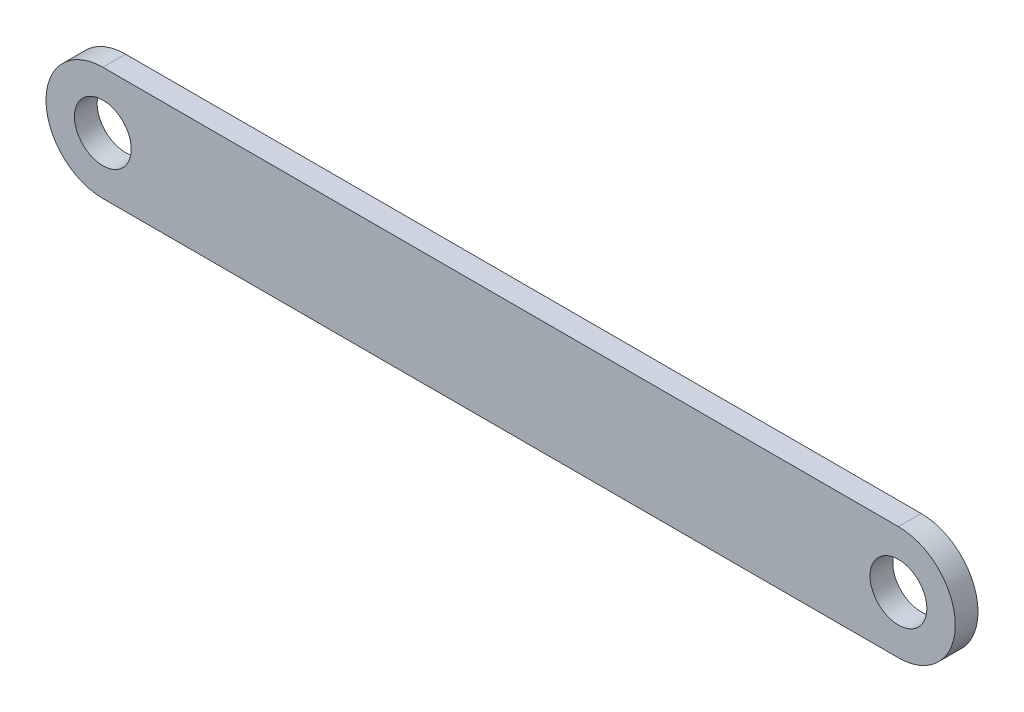
ISO-10303-21;
HEADER;
FILE_DESCRIPTION(('STEP AP214'),'2;1');
FILE_NAME('part.step','',(''),(''),'','','');
FILE_SCHEMA(('AUTOMOTIVE_DESIGN { 1 0 10303 214 1 1 1 1 }'));
ENDSEC;
DATA;
#1=APPLICATION_CONTEXT('core data for automotive mechanical design processes');
#2=APPLICATION_PROTOCOL_DEFINITION('international standard','automotive_design',2000,#1);
#3=PRODUCT_CONTEXT('',#1,'mechanical');
#4=PRODUCT('Part','Part','',(#3));
#5=PRODUCT_RELATED_PRODUCT_CATEGORY('part','',(#4));
#6=PRODUCT_DEFINITION_FORMATION('','',#4);
#7=PRODUCT_DEFINITION_CONTEXT('part definition',#1,'design');
#8=PRODUCT_DEFINITION('design','',#6,#7);
#9=PRODUCT_DEFINITION_SHAPE('','',#8);
#10=(LENGTH_UNIT() NAMED_UNIT(*) SI_UNIT(.MILLI.,.METRE.));
#11=(NAMED_UNIT(*) PLANE_ANGLE_UNIT() SI_UNIT($,.RADIAN.));
#12=(NAMED_UNIT(*) SI_UNIT($,.STERADIAN.) SOLID_ANGLE_UNIT());
#13=UNCERTAINTY_MEASURE_WITH_UNIT(LENGTH_MEASURE(1.E-05),#10,'distance_accuracy_value','');
#14=(GEOMETRIC_REPRESENTATION_CONTEXT(3) GLOBAL_UNCERTAINTY_ASSIGNED_CONTEXT((#13)) GLOBAL_UNIT_ASSIGNED_CONTEXT((#10,
#11,#12)) REPRESENTATION_CONTEXT('',''));
#15=CARTESIAN_POINT('',(0.,0.,0.));
#16=DIRECTION('',(0.,0.,1.));
#17=DIRECTION('',(1.,0.,0.));
#18=AXIS2_PLACEMENT_3D('',#15,#16,#17);
#19=CARTESIAN_POINT('',(-52.4425287356322,0.,2.));
#20=DIRECTION('',(0.,0.,1.));
#21=DIRECTION('',(1.,0.,0.));
#22=AXIS2_PLACEMENT_3D('',#19,#20,#21);
#23=PLANE('',#22);
#24=CARTESIAN_POINT('',(-52.4425287356322,0.,2.));
#25=DIRECTION('',(0.,0.,1.));
#26=DIRECTION('',(1.,0.,0.));
#27=AXIS2_PLACEMENT_3D('',#24,#25,#26);
#28=CIRCLE('',#27,2.5);
#29=CARTESIAN_POINT('',(-49.9425287356322,0.,2.));
#30=VERTEX_POINT('',#29);
#31=EDGE_CURVE('E108',#30,#30,#28,.T.);
#32=ORIENTED_EDGE('',*,*,#31,.F.);
#33=EDGE_LOOP('',(#32));
#34=FACE_BOUND('',#33,.T.);
#35=CARTESIAN_POINT('',(-52.4425287356322,0.,2.));
#36=DIRECTION('',(0.,0.,1.));
#37=DIRECTION('',(1.,0.,0.));
#38=AXIS2_PLACEMENT_3D('',#35,#36,#37);
#39=CIRCLE('',#38,5.);
#40=CARTESIAN_POINT('',(-52.4425287356322,5.,2.));
#41=VERTEX_POINT('',#40);
#42=CARTESIAN_POINT('',(-52.4425287356322,-5.,2.));
#43=VERTEX_POINT('',#42);
#44=EDGE_CURVE('E93',#41,#43,#39,.T.);
#45=ORIENTED_EDGE('',*,*,#44,.T.);
#46=DIRECTION('',(1.,0.,0.));
#47=VECTOR('',#46,1.);
#48=CARTESIAN_POINT('',(-52.4425287356322,-5.,2.));
#49=LINE('',#48,#47);
#50=CARTESIAN_POINT('',(17.5574712643678,-5.,2.));
#51=VERTEX_POINT('',#50);
#52=EDGE_CURVE('E88',#43,#51,#49,.T.);
#53=ORIENTED_EDGE('',*,*,#52,.T.);
#54=CARTESIAN_POINT('',(17.5574712643678,0.,2.));
#55=DIRECTION('',(0.,0.,1.));
#56=DIRECTION('',(1.,0.,0.));
#57=AXIS2_PLACEMENT_3D('',#54,#55,#56);
#58=CIRCLE('',#57,5.);
#59=CARTESIAN_POINT('',(17.5574712643678,5.,2.));
#60=VERTEX_POINT('',#59);
#61=EDGE_CURVE('E91',#51,#60,#58,.T.);
#62=ORIENTED_EDGE('',*,*,#61,.T.);
#63=DIRECTION('',(-1.,0.,0.));
#64=VECTOR('',#63,1.);
#65=CARTESIAN_POINT('',(-52.4425287356322,5.,2.));
#66=LINE('',#65,#64);
#67=EDGE_CURVE('E58',#60,#41,#66,.T.);
#68=ORIENTED_EDGE('',*,*,#67,.T.);
#69=EDGE_LOOP('',(#45,#53,#62,#68));
#70=FACE_BOUND('',#69,.T.);
#71=CARTESIAN_POINT('',(17.5574712643678,0.,2.));
#72=DIRECTION('',(0.,0.,1.));
#73=DIRECTION('',(1.,0.,0.));
#74=AXIS2_PLACEMENT_3D('',#71,#72,#73);
#75=CIRCLE('',#74,2.5);
#76=CARTESIAN_POINT('',(20.0574712643678,0.,2.));
#77=VERTEX_POINT('',#76);
#78=EDGE_CURVE('E123',#77,#77,#75,.T.);
#79=ORIENTED_EDGE('',*,*,#78,.F.);
#80=EDGE_LOOP('',(#79));
#81=FACE_BOUND('',#80,.T.);
#82=ADVANCED_FACE('F41',(#34,#70,#81),#23,.T.);
#83=CARTESIAN_POINT('',(-52.4425287356322,0.,0.));
#84=DIRECTION('',(0.,0.,1.));
#85=DIRECTION('',(1.,0.,0.));
#86=AXIS2_PLACEMENT_3D('',#83,#84,#85);
#87=PLANE('',#86);
#88=CARTESIAN_POINT('',(-52.4425287356322,0.,0.));
#89=DIRECTION('',(0.,0.,1.));
#90=DIRECTION('',(1.,0.,0.));
#91=AXIS2_PLACEMENT_3D('',#88,#89,#90);
#92=CIRCLE('',#91,5.);
#93=CARTESIAN_POINT('',(-52.4425287356322,5.,0.));
#94=VERTEX_POINT('',#93);
#95=CARTESIAN_POINT('',(-52.4425287356322,-5.,0.));
#96=VERTEX_POINT('',#95);
#97=EDGE_CURVE('E105',#94,#96,#92,.T.);
#98=ORIENTED_EDGE('',*,*,#97,.F.);
#99=DIRECTION('',(-1.,0.,0.));
#100=VECTOR('',#99,1.);
#101=CARTESIAN_POINT('',(-52.4425287356322,5.,0.));
#102=LINE('',#101,#100);
#103=CARTESIAN_POINT('',(17.5574712643678,5.,0.));
#104=VERTEX_POINT('',#103);
#105=EDGE_CURVE('E81',#104,#94,#102,.T.);
#106=ORIENTED_EDGE('',*,*,#105,.F.);
#107=CARTESIAN_POINT('',(17.5574712643678,0.,0.));
#108=DIRECTION('',(0.,0.,1.));
#109=DIRECTION('',(1.,0.,0.));
#110=AXIS2_PLACEMENT_3D('',#107,#108,#109);
#111=CIRCLE('',#110,5.);
#112=CARTESIAN_POINT('',(17.5574712643678,-5.,0.));
#113=VERTEX_POINT('',#112);
#114=EDGE_CURVE('E75',#113,#104,#111,.T.);
#115=ORIENTED_EDGE('',*,*,#114,.F.);
#116=DIRECTION('',(1.,0.,0.));
#117=VECTOR('',#116,1.);
#118=CARTESIAN_POINT('',(-52.4425287356322,-5.,0.));
#119=LINE('',#118,#117);
#120=EDGE_CURVE('E97',#96,#113,#119,.T.);
#121=ORIENTED_EDGE('',*,*,#120,.F.);
#122=EDGE_LOOP('',(#98,#106,#115,#121));
#123=FACE_BOUND('',#122,.T.);
#124=CARTESIAN_POINT('',(-52.4425287356322,0.,0.));
#125=DIRECTION('',(0.,0.,1.));
#126=DIRECTION('',(1.,0.,0.));
#127=AXIS2_PLACEMENT_3D('',#124,#125,#126);
#128=CIRCLE('',#127,2.5);
#129=CARTESIAN_POINT('',(-49.9425287356322,0.,0.));
#130=VERTEX_POINT('',#129);
#131=EDGE_CURVE('E120',#130,#130,#128,.T.);
#132=ORIENTED_EDGE('',*,*,#131,.T.);
#133=EDGE_LOOP('',(#132));
#134=FACE_BOUND('',#133,.T.);
#135=CARTESIAN_POINT('',(17.5574712643678,0.,0.));
#136=DIRECTION('',(0.,0.,1.));
#137=DIRECTION('',(1.,0.,0.));
#138=AXIS2_PLACEMENT_3D('',#135,#136,#137);
#139=CIRCLE('',#138,2.5);
#140=CARTESIAN_POINT('',(20.0574712643678,0.,0.));
#141=VERTEX_POINT('',#140);
#142=EDGE_CURVE('E126',#141,#141,#139,.T.);
#143=ORIENTED_EDGE('',*,*,#142,.T.);
#144=EDGE_LOOP('',(#143));
#145=FACE_BOUND('',#144,.T.);
#146=ADVANCED_FACE('F116',(#123,#134,#145),#87,.F.);
#147=CARTESIAN_POINT('',(-52.4425287356322,0.,2.));
#148=DIRECTION('',(0.,0.,-1.));
#149=DIRECTION('',(-1.,0.,0.));
#150=AXIS2_PLACEMENT_3D('',#147,#148,#149);
#151=CYLINDRICAL_SURFACE('',#150,5.);
#152=ORIENTED_EDGE('',*,*,#97,.T.);
#153=DIRECTION('',(0.,0.,-1.));
#154=VECTOR('',#153,1.);
#155=CARTESIAN_POINT('',(-52.4425287356322,-5.,2.));
#156=LINE('',#155,#154);
#157=EDGE_CURVE('E11',#43,#96,#156,.T.);
#158=ORIENTED_EDGE('',*,*,#157,.F.);
#159=ORIENTED_EDGE('',*,*,#44,.F.);
#160=DIRECTION('',(0.,0.,-1.));
#161=VECTOR('',#160,1.);
#162=CARTESIAN_POINT('',(-52.4425287356322,5.,2.));
#163=LINE('',#162,#161);
#164=EDGE_CURVE('E101',#41,#94,#163,.T.);
#165=ORIENTED_EDGE('',*,*,#164,.T.);
#166=EDGE_LOOP('',(#152,#158,#159,#165));
#167=FACE_BOUND('',#166,.T.);
#168=ADVANCED_FACE('F43',(#167),#151,.T.);
#169=CARTESIAN_POINT('',(-52.4425287356322,-5.,2.));
#170=DIRECTION('',(0.,1.,0.));
#171=DIRECTION('',(0.,0.,1.));
#172=AXIS2_PLACEMENT_3D('',#169,#170,#171);
#173=PLANE('',#172);
#174=ORIENTED_EDGE('',*,*,#120,.T.);
#175=DIRECTION('',(0.,0.,-1.));
#176=VECTOR('',#175,1.);
#177=CARTESIAN_POINT('',(17.5574712643678,-5.,2.));
#178=LINE('',#177,#176);
#179=EDGE_CURVE('E50',#51,#113,#178,.T.);
#180=ORIENTED_EDGE('',*,*,#179,.F.);
#181=ORIENTED_EDGE('',*,*,#52,.F.);
#182=ORIENTED_EDGE('',*,*,#157,.T.);
#183=EDGE_LOOP('',(#174,#180,#181,#182));
#184=FACE_BOUND('',#183,.T.);
#185=ADVANCED_FACE('F96',(#184),#173,.F.);
#186=CARTESIAN_POINT('',(17.5574712643678,0.,2.));
#187=DIRECTION('',(0.,0.,-1.));
#188=DIRECTION('',(-1.,0.,0.));
#189=AXIS2_PLACEMENT_3D('',#186,#187,#188);
#190=CYLINDRICAL_SURFACE('',#189,5.);
#191=ORIENTED_EDGE('',*,*,#114,.T.);
#192=DIRECTION('',(0.,0.,-1.));
#193=VECTOR('',#192,1.);
#194=CARTESIAN_POINT('',(17.5574712643678,5.,2.));
#195=LINE('',#194,#193);
#196=EDGE_CURVE('E98',#60,#104,#195,.T.);
#197=ORIENTED_EDGE('',*,*,#196,.F.);
#198=ORIENTED_EDGE('',*,*,#61,.F.);
#199=ORIENTED_EDGE('',*,*,#179,.T.);
#200=EDGE_LOOP('',(#191,#197,#198,#199));
#201=FACE_BOUND('',#200,.T.);
#202=ADVANCED_FACE('F99',(#201),#190,.T.);
#203=CARTESIAN_POINT('',(-52.4425287356322,5.,2.));
#204=DIRECTION('',(0.,-1.,0.));
#205=DIRECTION('',(0.,0.,-1.));
#206=AXIS2_PLACEMENT_3D('',#203,#204,#205);
#207=PLANE('',#206);
#208=ORIENTED_EDGE('',*,*,#105,.T.);
#209=ORIENTED_EDGE('',*,*,#164,.F.);
#210=ORIENTED_EDGE('',*,*,#67,.F.);
#211=ORIENTED_EDGE('',*,*,#196,.T.);
#212=EDGE_LOOP('',(#208,#209,#210,#211));
#213=FACE_BOUND('',#212,.T.);
#214=ADVANCED_FACE('F113',(#213),#207,.F.);
#215=CARTESIAN_POINT('',(-52.4425287356322,0.,2.));
#216=DIRECTION('',(0.,0.,-1.));
#217=DIRECTION('',(-1.,0.,0.));
#218=AXIS2_PLACEMENT_3D('',#215,#216,#217);
#219=CYLINDRICAL_SURFACE('',#218,2.5);
#220=ORIENTED_EDGE('',*,*,#31,.T.);
#221=EDGE_LOOP('',(#220));
#222=FACE_BOUND('',#221,.T.);
#223=ORIENTED_EDGE('',*,*,#131,.F.);
#224=EDGE_LOOP('',(#223));
#225=FACE_BOUND('',#224,.T.);
#226=ADVANCED_FACE('F143',(#222,#225),#219,.F.);
#227=CARTESIAN_POINT('',(17.5574712643678,0.,2.));
#228=DIRECTION('',(0.,0.,-1.));
#229=DIRECTION('',(-1.,0.,0.));
#230=AXIS2_PLACEMENT_3D('',#227,#228,#229);
#231=CYLINDRICAL_SURFACE('',#230,2.5);
#232=ORIENTED_EDGE('',*,*,#78,.T.);
#233=EDGE_LOOP('',(#232));
#234=FACE_BOUND('',#233,.T.);
#235=ORIENTED_EDGE('',*,*,#142,.F.);
#236=EDGE_LOOP('',(#235));
#237=FACE_BOUND('',#236,.T.);
#238=ADVANCED_FACE('F132',(#234,#237),#231,.F.);
#239=CLOSED_SHELL('',(#82,#146,#168,#185,#202,#214,#226,#238));
#240=MANIFOLD_SOLID_BREP('B2',#239);
#241=ADVANCED_BREP_SHAPE_REPRESENTATION('',(#18,#240),#14);
#242=SHAPE_DEFINITION_REPRESENTATION(#9,#241);
ENDSEC;
END-ISO-10303-21;
